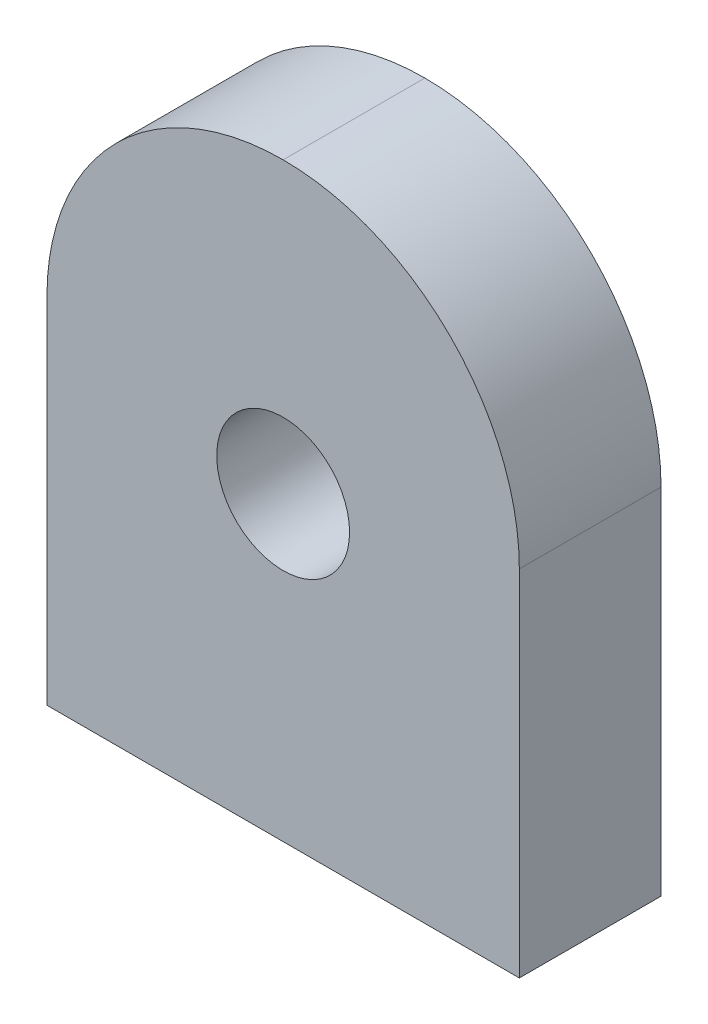
ISO-10303-21;
HEADER;
FILE_DESCRIPTION(('STEP AP214'),'2;1');
FILE_NAME('part.step','',(''),(''),'','','');
FILE_SCHEMA(('AUTOMOTIVE_DESIGN { 1 0 10303 214 1 1 1 1 }'));
ENDSEC;
DATA;
#1=APPLICATION_CONTEXT('core data for automotive mechanical design processes');
#2=APPLICATION_PROTOCOL_DEFINITION('international standard','automotive_design',2000,#1);
#3=PRODUCT_CONTEXT('',#1,'mechanical');
#4=PRODUCT('Part','Part','',(#3));
#5=PRODUCT_RELATED_PRODUCT_CATEGORY('part','',(#4));
#6=PRODUCT_DEFINITION_FORMATION('','',#4);
#7=PRODUCT_DEFINITION_CONTEXT('part definition',#1,'design');
#8=PRODUCT_DEFINITION('design','',#6,#7);
#9=PRODUCT_DEFINITION_SHAPE('','',#8);
#10=(LENGTH_UNIT() NAMED_UNIT(*) SI_UNIT(.MILLI.,.METRE.));
#11=(NAMED_UNIT(*) PLANE_ANGLE_UNIT() SI_UNIT($,.RADIAN.));
#12=(NAMED_UNIT(*) SI_UNIT($,.STERADIAN.) SOLID_ANGLE_UNIT());
#13=UNCERTAINTY_MEASURE_WITH_UNIT(LENGTH_MEASURE(1.E-05),#10,'distance_accuracy_value','');
#14=(GEOMETRIC_REPRESENTATION_CONTEXT(3) GLOBAL_UNCERTAINTY_ASSIGNED_CONTEXT((#13)) GLOBAL_UNIT_ASSIGNED_CONTEXT((#10,
#11,#12)) REPRESENTATION_CONTEXT('',''));
#15=CARTESIAN_POINT('',(0.,0.,0.));
#16=DIRECTION('',(0.,0.,1.));
#17=DIRECTION('',(1.,0.,0.));
#18=AXIS2_PLACEMENT_3D('',#15,#16,#17);
#19=CARTESIAN_POINT('',(0.,0.,4.8));
#20=DIRECTION('',(1.,0.,0.));
#21=DIRECTION('',(0.,0.,-1.));
#22=AXIS2_PLACEMENT_3D('',#19,#20,#21);
#23=PLANE('',#22);
#24=DIRECTION('',(0.,-1.,0.));
#25=VECTOR('',#24,1.);
#26=CARTESIAN_POINT('',(0.,0.,4.8));
#27=LINE('',#26,#25);
#28=CARTESIAN_POINT('',(0.,12.,4.8));
#29=VERTEX_POINT('',#28);
#30=CARTESIAN_POINT('',(0.,0.,4.8));
#31=VERTEX_POINT('',#30);
#32=EDGE_CURVE('E82',#29,#31,#27,.T.);
#33=ORIENTED_EDGE('',*,*,#32,.F.);
#34=DIRECTION('',(0.,0.,-1.));
#35=VECTOR('',#34,1.);
#36=CARTESIAN_POINT('',(0.,12.,4.8));
#37=LINE('',#36,#35);
#38=CARTESIAN_POINT('',(0.,12.,0.));
#39=VERTEX_POINT('',#38);
#40=EDGE_CURVE('E11',#29,#39,#37,.T.);
#41=ORIENTED_EDGE('',*,*,#40,.T.);
#42=DIRECTION('',(0.,-1.,0.));
#43=VECTOR('',#42,1.);
#44=CARTESIAN_POINT('',(0.,0.,0.));
#45=LINE('',#44,#43);
#46=CARTESIAN_POINT('',(0.,0.,0.));
#47=VERTEX_POINT('',#46);
#48=EDGE_CURVE('E102',#39,#47,#45,.T.);
#49=ORIENTED_EDGE('',*,*,#48,.T.);
#50=DIRECTION('',(0.,0.,-1.));
#51=VECTOR('',#50,1.);
#52=CARTESIAN_POINT('',(0.,0.,4.8));
#53=LINE('',#52,#51);
#54=EDGE_CURVE('E95',#31,#47,#53,.T.);
#55=ORIENTED_EDGE('',*,*,#54,.F.);
#56=EDGE_LOOP('',(#33,#41,#49,#55));
#57=FACE_BOUND('',#56,.T.);
#58=ADVANCED_FACE('F41',(#57),#23,.F.);
#59=CARTESIAN_POINT('',(0.,0.,4.8));
#60=DIRECTION('',(0.,1.,0.));
#61=DIRECTION('',(0.,0.,1.));
#62=AXIS2_PLACEMENT_3D('',#59,#60,#61);
#63=PLANE('',#62);
#64=DIRECTION('',(1.,0.,0.));
#65=VECTOR('',#64,1.);
#66=CARTESIAN_POINT('',(0.,0.,0.));
#67=LINE('',#66,#65);
#68=CARTESIAN_POINT('',(16.,0.,0.));
#69=VERTEX_POINT('',#68);
#70=EDGE_CURVE('E126',#47,#69,#67,.T.);
#71=ORIENTED_EDGE('',*,*,#70,.T.);
#72=DIRECTION('',(0.,0.,-1.));
#73=VECTOR('',#72,1.);
#74=CARTESIAN_POINT('',(16.,0.,4.8));
#75=LINE('',#74,#73);
#76=CARTESIAN_POINT('',(16.,0.,4.8));
#77=VERTEX_POINT('',#76);
#78=EDGE_CURVE('E97',#77,#69,#75,.T.);
#79=ORIENTED_EDGE('',*,*,#78,.F.);
#80=DIRECTION('',(1.,0.,0.));
#81=VECTOR('',#80,1.);
#82=CARTESIAN_POINT('',(0.,0.,4.8));
#83=LINE('',#82,#81);
#84=EDGE_CURVE('E85',#31,#77,#83,.T.);
#85=ORIENTED_EDGE('',*,*,#84,.F.);
#86=ORIENTED_EDGE('',*,*,#54,.T.);
#87=EDGE_LOOP('',(#71,#79,#85,#86));
#88=FACE_BOUND('',#87,.T.);
#89=ADVANCED_FACE('F94',(#88),#63,.F.);
#90=CARTESIAN_POINT('',(16.,0.,4.8));
#91=DIRECTION('',(-1.,0.,0.));
#92=DIRECTION('',(0.,0.,1.));
#93=AXIS2_PLACEMENT_3D('',#90,#91,#92);
#94=PLANE('',#93);
#95=DIRECTION('',(0.,1.,0.));
#96=VECTOR('',#95,1.);
#97=CARTESIAN_POINT('',(16.,0.,0.));
#98=LINE('',#97,#96);
#99=CARTESIAN_POINT('',(16.,12.,0.));
#100=VERTEX_POINT('',#99);
#101=EDGE_CURVE('E90',#69,#100,#98,.T.);
#102=ORIENTED_EDGE('',*,*,#101,.T.);
#103=DIRECTION('',(0.,0.,-1.));
#104=VECTOR('',#103,1.);
#105=CARTESIAN_POINT('',(16.,12.,4.8));
#106=LINE('',#105,#104);
#107=CARTESIAN_POINT('',(16.,12.,4.8));
#108=VERTEX_POINT('',#107);
#109=EDGE_CURVE('E112',#100,#108,#106,.F.);
#110=ORIENTED_EDGE('',*,*,#109,.T.);
#111=DIRECTION('',(0.,1.,0.));
#112=VECTOR('',#111,1.);
#113=CARTESIAN_POINT('',(16.,0.,4.8));
#114=LINE('',#113,#112);
#115=EDGE_CURVE('E99',#77,#108,#114,.T.);
#116=ORIENTED_EDGE('',*,*,#115,.F.);
#117=ORIENTED_EDGE('',*,*,#78,.T.);
#118=EDGE_LOOP('',(#102,#110,#116,#117));
#119=FACE_BOUND('',#118,.T.);
#120=ADVANCED_FACE('F119',(#119),#94,.F.);
#121=CARTESIAN_POINT('',(0.,0.,4.8));
#122=DIRECTION('',(0.,0.,-1.));
#123=DIRECTION('',(-1.,0.,0.));
#124=AXIS2_PLACEMENT_3D('',#121,#122,#123);
#125=PLANE('',#124);
#126=CARTESIAN_POINT('',(8.,10.2,4.8));
#127=DIRECTION('',(0.,0.,1.));
#128=DIRECTION('',(1.,0.,0.));
#129=AXIS2_PLACEMENT_3D('',#126,#127,#128);
#130=CIRCLE('',#129,2.25);
#131=CARTESIAN_POINT('',(10.25,10.2,4.8));
#132=VERTEX_POINT('',#131);
#133=EDGE_CURVE('E135',#132,#132,#130,.T.);
#134=ORIENTED_EDGE('',*,*,#133,.F.);
#135=EDGE_LOOP('',(#134));
#136=FACE_BOUND('',#135,.T.);
#137=ORIENTED_EDGE('',*,*,#115,.T.);
#138=CARTESIAN_POINT('',(8.,12.,4.8));
#139=DIRECTION('',(0.,0.,-1.));
#140=DIRECTION('',(-1.,0.,0.));
#141=AXIS2_PLACEMENT_3D('',#138,#139,#140);
#142=CIRCLE('',#141,8.);
#143=CARTESIAN_POINT('',(8.,20.,4.8));
#144=VERTEX_POINT('',#143);
#145=EDGE_CURVE('E50',#108,#144,#142,.F.);
#146=ORIENTED_EDGE('',*,*,#145,.T.);
#147=CARTESIAN_POINT('',(8.,12.,4.8));
#148=DIRECTION('',(0.,0.,-1.));
#149=DIRECTION('',(-1.,0.,0.));
#150=AXIS2_PLACEMENT_3D('',#147,#148,#149);
#151=CIRCLE('',#150,8.);
#152=EDGE_CURVE('E60',#144,#29,#151,.F.);
#153=ORIENTED_EDGE('',*,*,#152,.T.);
#154=ORIENTED_EDGE('',*,*,#32,.T.);
#155=ORIENTED_EDGE('',*,*,#84,.T.);
#156=EDGE_LOOP('',(#137,#146,#153,#154,#155));
#157=FACE_BOUND('',#156,.T.);
#158=ADVANCED_FACE('F84',(#136,#157),#125,.F.);
#159=CARTESIAN_POINT('',(0.,0.,0.));
#160=DIRECTION('',(0.,0.,-1.));
#161=DIRECTION('',(-1.,0.,0.));
#162=AXIS2_PLACEMENT_3D('',#159,#160,#161);
#163=PLANE('',#162);
#164=CARTESIAN_POINT('',(8.,10.2,0.));
#165=DIRECTION('',(0.,0.,1.));
#166=DIRECTION('',(1.,0.,0.));
#167=AXIS2_PLACEMENT_3D('',#164,#165,#166);
#168=CIRCLE('',#167,2.25);
#169=CARTESIAN_POINT('',(10.25,10.2,0.));
#170=VERTEX_POINT('',#169);
#171=EDGE_CURVE('E127',#170,#170,#168,.T.);
#172=ORIENTED_EDGE('',*,*,#171,.T.);
#173=EDGE_LOOP('',(#172));
#174=FACE_BOUND('',#173,.T.);
#175=CARTESIAN_POINT('',(8.,12.,0.));
#176=DIRECTION('',(0.,0.,-1.));
#177=DIRECTION('',(-1.,0.,0.));
#178=AXIS2_PLACEMENT_3D('',#175,#176,#177);
#179=CIRCLE('',#178,8.);
#180=CARTESIAN_POINT('',(8.,20.,0.));
#181=VERTEX_POINT('',#180);
#182=EDGE_CURVE('E104',#39,#181,#179,.T.);
#183=ORIENTED_EDGE('',*,*,#182,.T.);
#184=CARTESIAN_POINT('',(8.,12.,0.));
#185=DIRECTION('',(0.,0.,-1.));
#186=DIRECTION('',(-1.,0.,0.));
#187=AXIS2_PLACEMENT_3D('',#184,#185,#186);
#188=CIRCLE('',#187,8.);
#189=EDGE_CURVE('E106',#181,#100,#188,.T.);
#190=ORIENTED_EDGE('',*,*,#189,.T.);
#191=ORIENTED_EDGE('',*,*,#101,.F.);
#192=ORIENTED_EDGE('',*,*,#70,.F.);
#193=ORIENTED_EDGE('',*,*,#48,.F.);
#194=EDGE_LOOP('',(#183,#190,#191,#192,#193));
#195=FACE_BOUND('',#194,.T.);
#196=ADVANCED_FACE('F129',(#174,#195),#163,.T.);
#197=CARTESIAN_POINT('',(8.,10.2,0.));
#198=DIRECTION('',(0.,0.,1.));
#199=DIRECTION('',(1.,0.,0.));
#200=AXIS2_PLACEMENT_3D('',#197,#198,#199);
#201=CYLINDRICAL_SURFACE('',#200,2.25);
#202=ORIENTED_EDGE('',*,*,#171,.F.);
#203=EDGE_LOOP('',(#202));
#204=FACE_BOUND('',#203,.T.);
#205=ORIENTED_EDGE('',*,*,#133,.T.);
#206=EDGE_LOOP('',(#205));
#207=FACE_BOUND('',#206,.T.);
#208=ADVANCED_FACE('F145',(#204,#207),#201,.F.);
#209=CARTESIAN_POINT('',(8.,12.,4.8));
#210=DIRECTION('',(0.,0.,-1.));
#211=DIRECTION('',(-1.,0.,0.));
#212=AXIS2_PLACEMENT_3D('',#209,#210,#211);
#213=CYLINDRICAL_SURFACE('',#212,8.);
#214=ORIENTED_EDGE('',*,*,#40,.F.);
#215=ORIENTED_EDGE('',*,*,#152,.F.);
#216=DIRECTION('',(0.,0.,-1.));
#217=VECTOR('',#216,1.);
#218=CARTESIAN_POINT('',(8.,20.,4.8));
#219=LINE('',#218,#217);
#220=EDGE_CURVE('E45',#181,#144,#219,.F.);
#221=ORIENTED_EDGE('',*,*,#220,.F.);
#222=ORIENTED_EDGE('',*,*,#182,.F.);
#223=EDGE_LOOP('',(#214,#215,#221,#222));
#224=FACE_BOUND('',#223,.T.);
#225=ADVANCED_FACE('F43',(#224),#213,.T.);
#226=CARTESIAN_POINT('',(8.,12.,4.8));
#227=DIRECTION('',(0.,0.,-1.));
#228=DIRECTION('',(-1.,0.,0.));
#229=AXIS2_PLACEMENT_3D('',#226,#227,#228);
#230=CYLINDRICAL_SURFACE('',#229,8.);
#231=ORIENTED_EDGE('',*,*,#145,.F.);
#232=ORIENTED_EDGE('',*,*,#109,.F.);
#233=ORIENTED_EDGE('',*,*,#189,.F.);
#234=ORIENTED_EDGE('',*,*,#220,.T.);
#235=EDGE_LOOP('',(#231,#232,#233,#234));
#236=FACE_BOUND('',#235,.T.);
#237=ADVANCED_FACE('F133',(#236),#230,.T.);
#238=CLOSED_SHELL('',(#58,#89,#120,#158,#196,#208,#225,#237));
#239=MANIFOLD_SOLID_BREP('B2',#238);
#240=ADVANCED_BREP_SHAPE_REPRESENTATION('',(#18,#239),#14);
#241=SHAPE_DEFINITION_REPRESENTATION(#9,#240);
ENDSEC;
END-ISO-10303-21;
